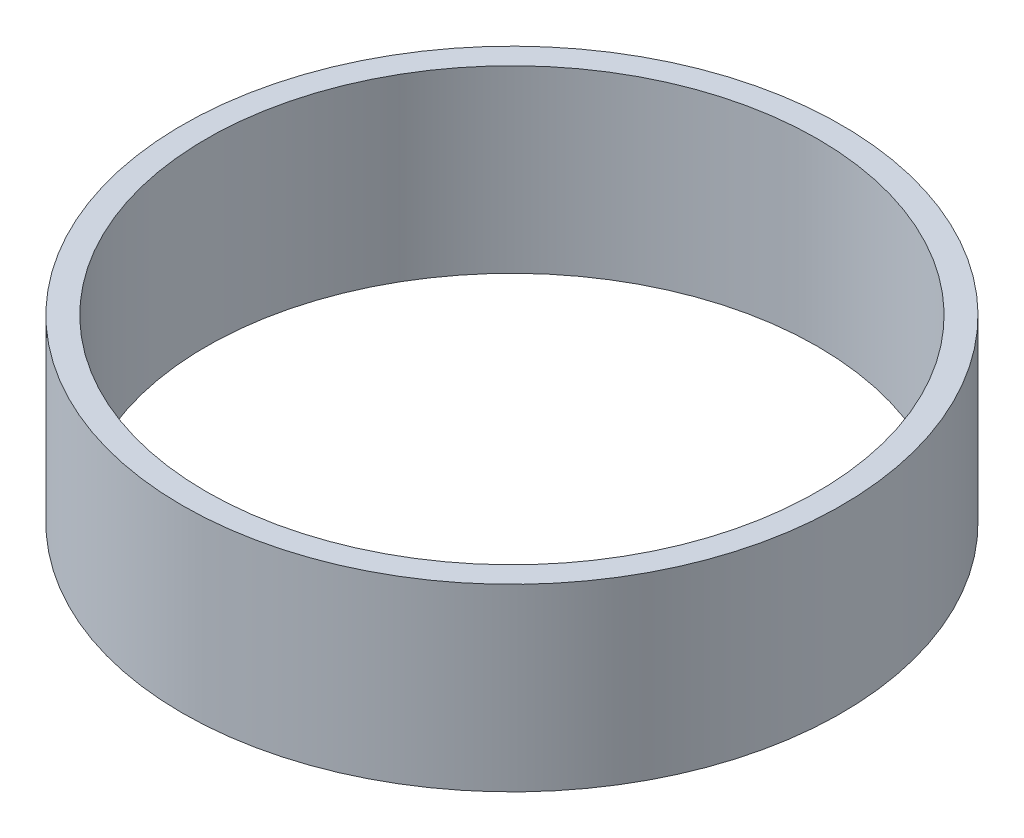
ISO-10303-21;
HEADER;
FILE_DESCRIPTION(('STEP AP214'),'2;1');
FILE_NAME('part.step','',(''),(''),'','','');
FILE_SCHEMA(('AUTOMOTIVE_DESIGN { 1 0 10303 214 1 1 1 1 }'));
ENDSEC;
DATA;
#1=APPLICATION_CONTEXT('core data for automotive mechanical design processes');
#2=APPLICATION_PROTOCOL_DEFINITION('international standard','automotive_design',2000,#1);
#3=PRODUCT_CONTEXT('',#1,'mechanical');
#4=PRODUCT('Part','Part','',(#3));
#5=PRODUCT_RELATED_PRODUCT_CATEGORY('part','',(#4));
#6=PRODUCT_DEFINITION_FORMATION('','',#4);
#7=PRODUCT_DEFINITION_CONTEXT('part definition',#1,'design');
#8=PRODUCT_DEFINITION('design','',#6,#7);
#9=PRODUCT_DEFINITION_SHAPE('','',#8);
#10=(LENGTH_UNIT() NAMED_UNIT(*) SI_UNIT(.MILLI.,.METRE.));
#11=(NAMED_UNIT(*) PLANE_ANGLE_UNIT() SI_UNIT($,.RADIAN.));
#12=(NAMED_UNIT(*) SI_UNIT($,.STERADIAN.) SOLID_ANGLE_UNIT());
#13=UNCERTAINTY_MEASURE_WITH_UNIT(LENGTH_MEASURE(1.E-05),#10,'distance_accuracy_value','');
#14=(GEOMETRIC_REPRESENTATION_CONTEXT(3) GLOBAL_UNCERTAINTY_ASSIGNED_CONTEXT((#13)) GLOBAL_UNIT_ASSIGNED_CONTEXT((#10,
#11,#12)) REPRESENTATION_CONTEXT('',''));
#15=CARTESIAN_POINT('',(0.,0.,0.));
#16=DIRECTION('',(0.,0.,1.));
#17=DIRECTION('',(1.,0.,0.));
#18=AXIS2_PLACEMENT_3D('',#15,#16,#17);
#19=CARTESIAN_POINT('',(0.,6.,0.));
#20=DIRECTION('',(0.,1.,0.));
#21=DIRECTION('',(0.,0.,1.));
#22=AXIS2_PLACEMENT_3D('',#19,#20,#21);
#23=PLANE('',#22);
#24=CARTESIAN_POINT('',(0.,6.,0.));
#25=DIRECTION('',(0.,1.,0.));
#26=DIRECTION('',(0.,0.,1.));
#27=AXIS2_PLACEMENT_3D('',#24,#25,#26);
#28=CIRCLE('',#27,11.);
#29=CARTESIAN_POINT('',(0.,6.,11.));
#30=VERTEX_POINT('',#29);
#31=EDGE_CURVE('E10',#30,#30,#28,.T.);
#32=ORIENTED_EDGE('',*,*,#31,.T.);
#33=EDGE_LOOP('',(#32));
#34=FACE_BOUND('',#33,.T.);
#35=CARTESIAN_POINT('',(0.,6.,0.));
#36=DIRECTION('',(0.,1.,0.));
#37=DIRECTION('',(0.,0.,1.));
#38=AXIS2_PLACEMENT_3D('',#35,#36,#37);
#39=CIRCLE('',#38,10.2);
#40=CARTESIAN_POINT('',(0.,6.,10.2));
#41=VERTEX_POINT('',#40);
#42=EDGE_CURVE('E42',#41,#41,#39,.T.);
#43=ORIENTED_EDGE('',*,*,#42,.F.);
#44=EDGE_LOOP('',(#43));
#45=FACE_BOUND('',#44,.T.);
#46=ADVANCED_FACE('F31',(#34,#45),#23,.T.);
#47=CARTESIAN_POINT('',(0.,0.,0.));
#48=DIRECTION('',(0.,1.,0.));
#49=DIRECTION('',(0.,0.,1.));
#50=AXIS2_PLACEMENT_3D('',#47,#48,#49);
#51=PLANE('',#50);
#52=CARTESIAN_POINT('',(0.,0.,0.));
#53=DIRECTION('',(0.,1.,0.));
#54=DIRECTION('',(0.,0.,1.));
#55=AXIS2_PLACEMENT_3D('',#52,#53,#54);
#56=CIRCLE('',#55,11.);
#57=CARTESIAN_POINT('',(0.,0.,11.));
#58=VERTEX_POINT('',#57);
#59=EDGE_CURVE('E35',#58,#58,#56,.T.);
#60=ORIENTED_EDGE('',*,*,#59,.F.);
#61=EDGE_LOOP('',(#60));
#62=FACE_BOUND('',#61,.T.);
#63=CARTESIAN_POINT('',(0.,0.,0.));
#64=DIRECTION('',(0.,1.,0.));
#65=DIRECTION('',(0.,0.,1.));
#66=AXIS2_PLACEMENT_3D('',#63,#64,#65);
#67=CIRCLE('',#66,10.2);
#68=CARTESIAN_POINT('',(0.,0.,10.2));
#69=VERTEX_POINT('',#68);
#70=EDGE_CURVE('E44',#69,#69,#67,.T.);
#71=ORIENTED_EDGE('',*,*,#70,.T.);
#72=EDGE_LOOP('',(#71));
#73=FACE_BOUND('',#72,.T.);
#74=ADVANCED_FACE('F54',(#62,#73),#51,.F.);
#75=CARTESIAN_POINT('',(0.,6.,0.));
#76=DIRECTION('',(0.,-1.,0.));
#77=DIRECTION('',(0.,0.,-1.));
#78=AXIS2_PLACEMENT_3D('',#75,#76,#77);
#79=CYLINDRICAL_SURFACE('',#78,11.);
#80=ORIENTED_EDGE('',*,*,#31,.F.);
#81=EDGE_LOOP('',(#80));
#82=FACE_BOUND('',#81,.T.);
#83=ORIENTED_EDGE('',*,*,#59,.T.);
#84=EDGE_LOOP('',(#83));
#85=FACE_BOUND('',#84,.T.);
#86=ADVANCED_FACE('F33',(#82,#85),#79,.T.);
#87=CARTESIAN_POINT('',(0.,6.,0.));
#88=DIRECTION('',(0.,-1.,0.));
#89=DIRECTION('',(0.,0.,-1.));
#90=AXIS2_PLACEMENT_3D('',#87,#88,#89);
#91=CYLINDRICAL_SURFACE('',#90,10.2);
#92=ORIENTED_EDGE('',*,*,#42,.T.);
#93=EDGE_LOOP('',(#92));
#94=FACE_BOUND('',#93,.T.);
#95=ORIENTED_EDGE('',*,*,#70,.F.);
#96=EDGE_LOOP('',(#95));
#97=FACE_BOUND('',#96,.T.);
#98=ADVANCED_FACE('F50',(#94,#97),#91,.F.);
#99=CLOSED_SHELL('',(#46,#74,#86,#98));
#100=MANIFOLD_SOLID_BREP('B2',#99);
#101=ADVANCED_BREP_SHAPE_REPRESENTATION('',(#18,#100),#14);
#102=SHAPE_DEFINITION_REPRESENTATION(#9,#101);
ENDSEC;
END-ISO-10303-21;
